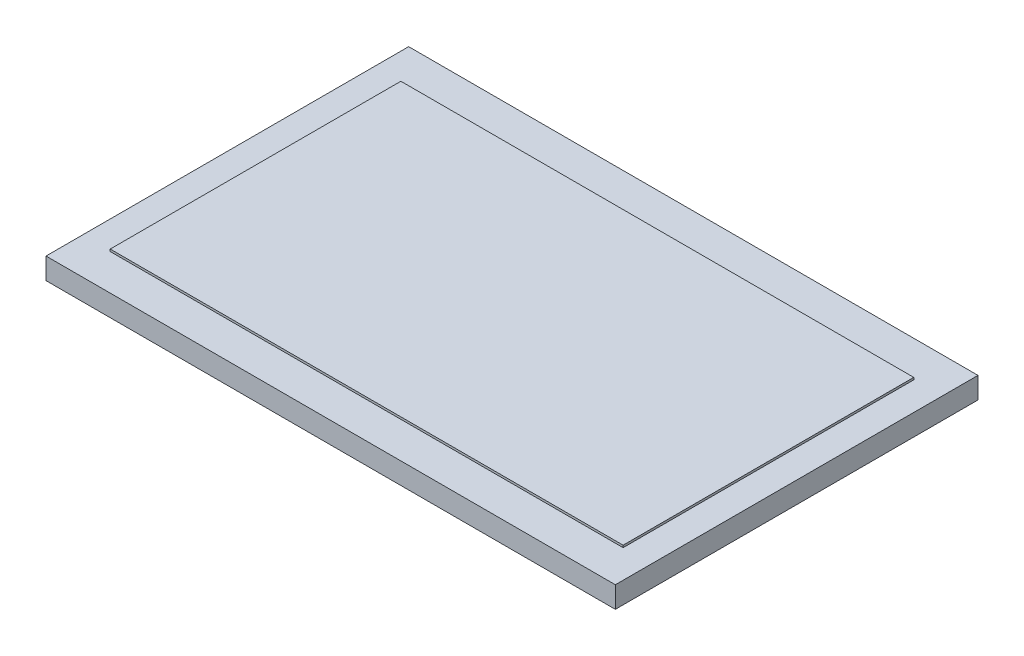
ISO-10303-21;
HEADER;
FILE_DESCRIPTION(('STEP AP214'),'2;1');
FILE_NAME('part.step','',(''),(''),'','','');
FILE_SCHEMA(('AUTOMOTIVE_DESIGN { 1 0 10303 214 1 1 1 1 }'));
ENDSEC;
DATA;
#1=APPLICATION_CONTEXT('core data for automotive mechanical design processes');
#2=APPLICATION_PROTOCOL_DEFINITION('international standard','automotive_design',2000,#1);
#3=PRODUCT_CONTEXT('',#1,'mechanical');
#4=PRODUCT('Part','Part','',(#3));
#5=PRODUCT_RELATED_PRODUCT_CATEGORY('part','',(#4));
#6=PRODUCT_DEFINITION_FORMATION('','',#4);
#7=PRODUCT_DEFINITION_CONTEXT('part definition',#1,'design');
#8=PRODUCT_DEFINITION('design','',#6,#7);
#9=PRODUCT_DEFINITION_SHAPE('','',#8);
#10=(LENGTH_UNIT() NAMED_UNIT(*) SI_UNIT(.MILLI.,.METRE.));
#11=(NAMED_UNIT(*) PLANE_ANGLE_UNIT() SI_UNIT($,.RADIAN.));
#12=(NAMED_UNIT(*) SI_UNIT($,.STERADIAN.) SOLID_ANGLE_UNIT());
#13=UNCERTAINTY_MEASURE_WITH_UNIT(LENGTH_MEASURE(1.E-05),#10,'distance_accuracy_value','');
#14=(GEOMETRIC_REPRESENTATION_CONTEXT(3) GLOBAL_UNCERTAINTY_ASSIGNED_CONTEXT((#13)) GLOBAL_UNIT_ASSIGNED_CONTEXT((#10,
#11,#12)) REPRESENTATION_CONTEXT('',''));
#15=CARTESIAN_POINT('',(0.,0.,0.));
#16=DIRECTION('',(0.,0.,1.));
#17=DIRECTION('',(1.,0.,0.));
#18=AXIS2_PLACEMENT_3D('',#15,#16,#17);
#19=CARTESIAN_POINT('',(0.,3.95,-67.2));
#20=DIRECTION('',(0.,-1.,0.));
#21=DIRECTION('',(0.,0.,-1.));
#22=AXIS2_PLACEMENT_3D('',#19,#20,#21);
#23=PLANE('',#22);
#24=DIRECTION('',(0.,0.,1.));
#25=VECTOR('',#24,1.);
#26=CARTESIAN_POINT('',(0.,3.95,0.));
#27=LINE('',#26,#25);
#28=CARTESIAN_POINT('',(0.,3.95,-67.2));
#29=VERTEX_POINT('',#28);
#30=CARTESIAN_POINT('',(0.,3.95,0.));
#31=VERTEX_POINT('',#30);
#32=EDGE_CURVE('E126',#29,#31,#27,.T.);
#33=ORIENTED_EDGE('',*,*,#32,.T.);
#34=DIRECTION('',(1.,0.,0.));
#35=VECTOR('',#34,1.);
#36=CARTESIAN_POINT('',(0.,3.95,0.));
#37=LINE('',#36,#35);
#38=CARTESIAN_POINT('',(105.5,3.95,0.));
#39=VERTEX_POINT('',#38);
#40=EDGE_CURVE('E129',#31,#39,#37,.T.);
#41=ORIENTED_EDGE('',*,*,#40,.T.);
#42=DIRECTION('',(0.,0.,-1.));
#43=VECTOR('',#42,1.);
#44=CARTESIAN_POINT('',(105.5,3.95,0.));
#45=LINE('',#44,#43);
#46=CARTESIAN_POINT('',(105.5,3.95,-67.2));
#47=VERTEX_POINT('',#46);
#48=EDGE_CURVE('E132',#39,#47,#45,.T.);
#49=ORIENTED_EDGE('',*,*,#48,.T.);
#50=DIRECTION('',(-1.,0.,0.));
#51=VECTOR('',#50,1.);
#52=CARTESIAN_POINT('',(0.,3.95,-67.2));
#53=LINE('',#52,#51);
#54=EDGE_CURVE('E134',#47,#29,#53,.T.);
#55=ORIENTED_EDGE('',*,*,#54,.T.);
#56=EDGE_LOOP('',(#33,#41,#49,#55));
#57=FACE_BOUND('',#56,.T.);
#58=DIRECTION('',(0.,0.,1.));
#59=VECTOR('',#58,1.);
#60=CARTESIAN_POINT('',(5.22999999999998,3.95,-60.526));
#61=LINE('',#60,#59);
#62=CARTESIAN_POINT('',(5.22999999999998,3.95,-60.526));
#63=VERTEX_POINT('',#62);
#64=CARTESIAN_POINT('',(5.23,3.95,-6.67));
#65=VERTEX_POINT('',#64);
#66=EDGE_CURVE('E116',#63,#65,#61,.T.);
#67=ORIENTED_EDGE('',*,*,#66,.F.);
#68=DIRECTION('',(-1.,0.,0.));
#69=VECTOR('',#68,1.);
#70=CARTESIAN_POINT('',(5.22999999999998,3.95,-60.526));
#71=LINE('',#70,#69);
#72=CARTESIAN_POINT('',(100.27,3.95,-60.526));
#73=VERTEX_POINT('',#72);
#74=EDGE_CURVE('E113',#73,#63,#71,.T.);
#75=ORIENTED_EDGE('',*,*,#74,.F.);
#76=DIRECTION('',(0.,0.,-1.));
#77=VECTOR('',#76,1.);
#78=CARTESIAN_POINT('',(100.27,3.95,-60.526));
#79=LINE('',#78,#77);
#80=CARTESIAN_POINT('',(100.27,3.95,-6.67));
#81=VERTEX_POINT('',#80);
#82=EDGE_CURVE('E51',#81,#73,#79,.T.);
#83=ORIENTED_EDGE('',*,*,#82,.F.);
#84=DIRECTION('',(1.,0.,0.));
#85=VECTOR('',#84,1.);
#86=CARTESIAN_POINT('',(5.23,3.95,-6.67));
#87=LINE('',#86,#85);
#88=EDGE_CURVE('E46',#65,#81,#87,.T.);
#89=ORIENTED_EDGE('',*,*,#88,.F.);
#90=EDGE_LOOP('',(#67,#75,#83,#89));
#91=FACE_BOUND('',#90,.T.);
#92=ADVANCED_FACE('F31',(#57,#91),#23,.F.);
#93=CARTESIAN_POINT('',(0.,3.95,0.));
#94=DIRECTION('',(1.,0.,0.));
#95=DIRECTION('',(0.,0.,-1.));
#96=AXIS2_PLACEMENT_3D('',#93,#94,#95);
#97=PLANE('',#96);
#98=DIRECTION('',(0.,0.,1.));
#99=VECTOR('',#98,1.);
#100=CARTESIAN_POINT('',(0.,0.,0.));
#101=LINE('',#100,#99);
#102=CARTESIAN_POINT('',(0.,0.,-67.2));
#103=VERTEX_POINT('',#102);
#104=CARTESIAN_POINT('',(0.,0.,0.));
#105=VERTEX_POINT('',#104);
#106=EDGE_CURVE('E117',#103,#105,#101,.T.);
#107=ORIENTED_EDGE('',*,*,#106,.T.);
#108=DIRECTION('',(0.,-1.,0.));
#109=VECTOR('',#108,1.);
#110=CARTESIAN_POINT('',(0.,3.95,0.));
#111=LINE('',#110,#109);
#112=EDGE_CURVE('E11',#31,#105,#111,.T.);
#113=ORIENTED_EDGE('',*,*,#112,.F.);
#114=ORIENTED_EDGE('',*,*,#32,.F.);
#115=DIRECTION('',(0.,-1.,0.));
#116=VECTOR('',#115,1.);
#117=CARTESIAN_POINT('',(0.,3.95,-67.2));
#118=LINE('',#117,#116);
#119=EDGE_CURVE('E135',#29,#103,#118,.T.);
#120=ORIENTED_EDGE('',*,*,#119,.T.);
#121=EDGE_LOOP('',(#107,#113,#114,#120));
#122=FACE_BOUND('',#121,.T.);
#123=ADVANCED_FACE('F33',(#122),#97,.F.);
#124=CARTESIAN_POINT('',(0.,3.95,0.));
#125=DIRECTION('',(0.,0.,-1.));
#126=DIRECTION('',(-1.,0.,0.));
#127=AXIS2_PLACEMENT_3D('',#124,#125,#126);
#128=PLANE('',#127);
#129=DIRECTION('',(1.,0.,0.));
#130=VECTOR('',#129,1.);
#131=CARTESIAN_POINT('',(0.,0.,0.));
#132=LINE('',#131,#130);
#133=CARTESIAN_POINT('',(105.5,0.,0.));
#134=VERTEX_POINT('',#133);
#135=EDGE_CURVE('E120',#105,#134,#132,.T.);
#136=ORIENTED_EDGE('',*,*,#135,.T.);
#137=DIRECTION('',(0.,-1.,0.));
#138=VECTOR('',#137,1.);
#139=CARTESIAN_POINT('',(105.5,3.95,0.));
#140=LINE('',#139,#138);
#141=EDGE_CURVE('E39',#39,#134,#140,.T.);
#142=ORIENTED_EDGE('',*,*,#141,.F.);
#143=ORIENTED_EDGE('',*,*,#40,.F.);
#144=ORIENTED_EDGE('',*,*,#112,.T.);
#145=EDGE_LOOP('',(#136,#142,#143,#144));
#146=FACE_BOUND('',#145,.T.);
#147=ADVANCED_FACE('F165',(#146),#128,.F.);
#148=CARTESIAN_POINT('',(105.5,3.95,0.));
#149=DIRECTION('',(-1.,0.,0.));
#150=DIRECTION('',(0.,0.,1.));
#151=AXIS2_PLACEMENT_3D('',#148,#149,#150);
#152=PLANE('',#151);
#153=DIRECTION('',(0.,0.,-1.));
#154=VECTOR('',#153,1.);
#155=CARTESIAN_POINT('',(105.5,0.,0.));
#156=LINE('',#155,#154);
#157=CARTESIAN_POINT('',(105.5,0.,-67.2));
#158=VERTEX_POINT('',#157);
#159=EDGE_CURVE('E138',#134,#158,#156,.T.);
#160=ORIENTED_EDGE('',*,*,#159,.T.);
#161=DIRECTION('',(0.,-1.,0.));
#162=VECTOR('',#161,1.);
#163=CARTESIAN_POINT('',(105.5,3.95,-67.2));
#164=LINE('',#163,#162);
#165=EDGE_CURVE('E143',#47,#158,#164,.T.);
#166=ORIENTED_EDGE('',*,*,#165,.F.);
#167=ORIENTED_EDGE('',*,*,#48,.F.);
#168=ORIENTED_EDGE('',*,*,#141,.T.);
#169=EDGE_LOOP('',(#160,#166,#167,#168));
#170=FACE_BOUND('',#169,.T.);
#171=ADVANCED_FACE('F150',(#170),#152,.F.);
#172=CARTESIAN_POINT('',(0.,3.95,-67.2));
#173=DIRECTION('',(0.,0.,1.));
#174=DIRECTION('',(1.,0.,0.));
#175=AXIS2_PLACEMENT_3D('',#172,#173,#174);
#176=PLANE('',#175);
#177=DIRECTION('',(-1.,0.,0.));
#178=VECTOR('',#177,1.);
#179=CARTESIAN_POINT('',(0.,0.,-67.2));
#180=LINE('',#179,#178);
#181=EDGE_CURVE('E130',#158,#103,#180,.T.);
#182=ORIENTED_EDGE('',*,*,#181,.T.);
#183=ORIENTED_EDGE('',*,*,#119,.F.);
#184=ORIENTED_EDGE('',*,*,#54,.F.);
#185=ORIENTED_EDGE('',*,*,#165,.T.);
#186=EDGE_LOOP('',(#182,#183,#184,#185));
#187=FACE_BOUND('',#186,.T.);
#188=ADVANCED_FACE('F159',(#187),#176,.F.);
#189=CARTESIAN_POINT('',(0.,0.,-67.2));
#190=DIRECTION('',(0.,-1.,0.));
#191=DIRECTION('',(0.,0.,-1.));
#192=AXIS2_PLACEMENT_3D('',#189,#190,#191);
#193=PLANE('',#192);
#194=ORIENTED_EDGE('',*,*,#106,.F.);
#195=ORIENTED_EDGE('',*,*,#181,.F.);
#196=ORIENTED_EDGE('',*,*,#159,.F.);
#197=ORIENTED_EDGE('',*,*,#135,.F.);
#198=EDGE_LOOP('',(#194,#195,#196,#197));
#199=FACE_BOUND('',#198,.T.);
#200=ADVANCED_FACE('F156',(#199),#193,.T.);
#201=CARTESIAN_POINT('',(5.22999999999998,4.35,-60.526));
#202=DIRECTION('',(1.,0.,0.));
#203=DIRECTION('',(0.,0.,-1.));
#204=AXIS2_PLACEMENT_3D('',#201,#202,#203);
#205=PLANE('',#204);
#206=ORIENTED_EDGE('',*,*,#66,.T.);
#207=DIRECTION('',(0.,-1.,0.));
#208=VECTOR('',#207,1.);
#209=CARTESIAN_POINT('',(5.23,4.35,-6.67));
#210=LINE('',#209,#208);
#211=CARTESIAN_POINT('',(5.23,4.35,-6.67));
#212=VERTEX_POINT('',#211);
#213=EDGE_CURVE('E97',#212,#65,#210,.T.);
#214=ORIENTED_EDGE('',*,*,#213,.F.);
#215=DIRECTION('',(0.,0.,1.));
#216=VECTOR('',#215,1.);
#217=CARTESIAN_POINT('',(5.22999999999998,4.35,-60.526));
#218=LINE('',#217,#216);
#219=CARTESIAN_POINT('',(5.22999999999998,4.35,-60.526));
#220=VERTEX_POINT('',#219);
#221=EDGE_CURVE('E104',#220,#212,#218,.T.);
#222=ORIENTED_EDGE('',*,*,#221,.F.);
#223=DIRECTION('',(0.,-1.,0.));
#224=VECTOR('',#223,1.);
#225=CARTESIAN_POINT('',(5.22999999999998,4.35,-60.526));
#226=LINE('',#225,#224);
#227=EDGE_CURVE('E258',#220,#63,#226,.T.);
#228=ORIENTED_EDGE('',*,*,#227,.T.);
#229=EDGE_LOOP('',(#206,#214,#222,#228));
#230=FACE_BOUND('',#229,.T.);
#231=ADVANCED_FACE('F115',(#230),#205,.F.);
#232=CARTESIAN_POINT('',(5.23,4.35,-6.67));
#233=DIRECTION('',(0.,0.,-1.));
#234=DIRECTION('',(-1.,0.,0.));
#235=AXIS2_PLACEMENT_3D('',#232,#233,#234);
#236=PLANE('',#235);
#237=ORIENTED_EDGE('',*,*,#88,.T.);
#238=DIRECTION('',(0.,-1.,0.));
#239=VECTOR('',#238,1.);
#240=CARTESIAN_POINT('',(100.27,4.35,-6.67));
#241=LINE('',#240,#239);
#242=CARTESIAN_POINT('',(100.27,4.35,-6.67));
#243=VERTEX_POINT('',#242);
#244=EDGE_CURVE('E100',#243,#81,#241,.T.);
#245=ORIENTED_EDGE('',*,*,#244,.F.);
#246=DIRECTION('',(1.,0.,0.));
#247=VECTOR('',#246,1.);
#248=CARTESIAN_POINT('',(5.23,4.35,-6.67));
#249=LINE('',#248,#247);
#250=EDGE_CURVE('E93',#212,#243,#249,.T.);
#251=ORIENTED_EDGE('',*,*,#250,.F.);
#252=ORIENTED_EDGE('',*,*,#213,.T.);
#253=EDGE_LOOP('',(#237,#245,#251,#252));
#254=FACE_BOUND('',#253,.T.);
#255=ADVANCED_FACE('F95',(#254),#236,.F.);
#256=CARTESIAN_POINT('',(100.27,4.35,-60.526));
#257=DIRECTION('',(-1.,0.,0.));
#258=DIRECTION('',(0.,0.,1.));
#259=AXIS2_PLACEMENT_3D('',#256,#257,#258);
#260=PLANE('',#259);
#261=ORIENTED_EDGE('',*,*,#82,.T.);
#262=DIRECTION('',(0.,-1.,0.));
#263=VECTOR('',#262,1.);
#264=CARTESIAN_POINT('',(100.27,4.35,-60.526));
#265=LINE('',#264,#263);
#266=CARTESIAN_POINT('',(100.27,4.35,-60.526));
#267=VERTEX_POINT('',#266);
#268=EDGE_CURVE('E122',#267,#73,#265,.T.);
#269=ORIENTED_EDGE('',*,*,#268,.F.);
#270=DIRECTION('',(0.,0.,-1.));
#271=VECTOR('',#270,1.);
#272=CARTESIAN_POINT('',(100.27,4.35,-60.526));
#273=LINE('',#272,#271);
#274=EDGE_CURVE('E103',#243,#267,#273,.T.);
#275=ORIENTED_EDGE('',*,*,#274,.F.);
#276=ORIENTED_EDGE('',*,*,#244,.T.);
#277=EDGE_LOOP('',(#261,#269,#275,#276));
#278=FACE_BOUND('',#277,.T.);
#279=ADVANCED_FACE('F201',(#278),#260,.F.);
#280=CARTESIAN_POINT('',(5.22999999999998,4.35,-60.526));
#281=DIRECTION('',(0.,0.,1.));
#282=DIRECTION('',(1.,0.,0.));
#283=AXIS2_PLACEMENT_3D('',#280,#281,#282);
#284=PLANE('',#283);
#285=ORIENTED_EDGE('',*,*,#74,.T.);
#286=ORIENTED_EDGE('',*,*,#227,.F.);
#287=DIRECTION('',(-1.,0.,0.));
#288=VECTOR('',#287,1.);
#289=CARTESIAN_POINT('',(5.22999999999998,4.35,-60.526));
#290=LINE('',#289,#288);
#291=EDGE_CURVE('E109',#267,#220,#290,.T.);
#292=ORIENTED_EDGE('',*,*,#291,.F.);
#293=ORIENTED_EDGE('',*,*,#268,.T.);
#294=EDGE_LOOP('',(#285,#286,#292,#293));
#295=FACE_BOUND('',#294,.T.);
#296=ADVANCED_FACE('F207',(#295),#284,.F.);
#297=CARTESIAN_POINT('',(5.23,4.35,-6.67));
#298=DIRECTION('',(0.,1.,0.));
#299=DIRECTION('',(0.,0.,1.));
#300=AXIS2_PLACEMENT_3D('',#297,#298,#299);
#301=PLANE('',#300);
#302=ORIENTED_EDGE('',*,*,#221,.T.);
#303=ORIENTED_EDGE('',*,*,#250,.T.);
#304=ORIENTED_EDGE('',*,*,#274,.T.);
#305=ORIENTED_EDGE('',*,*,#291,.T.);
#306=EDGE_LOOP('',(#302,#303,#304,#305));
#307=FACE_BOUND('',#306,.T.);
#308=ADVANCED_FACE('F107',(#307),#301,.T.);
#309=CLOSED_SHELL('',(#92,#123,#147,#171,#188,#200,#231,#255,#279,#296,#308));
#310=MANIFOLD_SOLID_BREP('B2',#309);
#311=ADVANCED_BREP_SHAPE_REPRESENTATION('',(#18,#310),#14);
#312=SHAPE_DEFINITION_REPRESENTATION(#9,#311);
ENDSEC;
END-ISO-10303-21;
